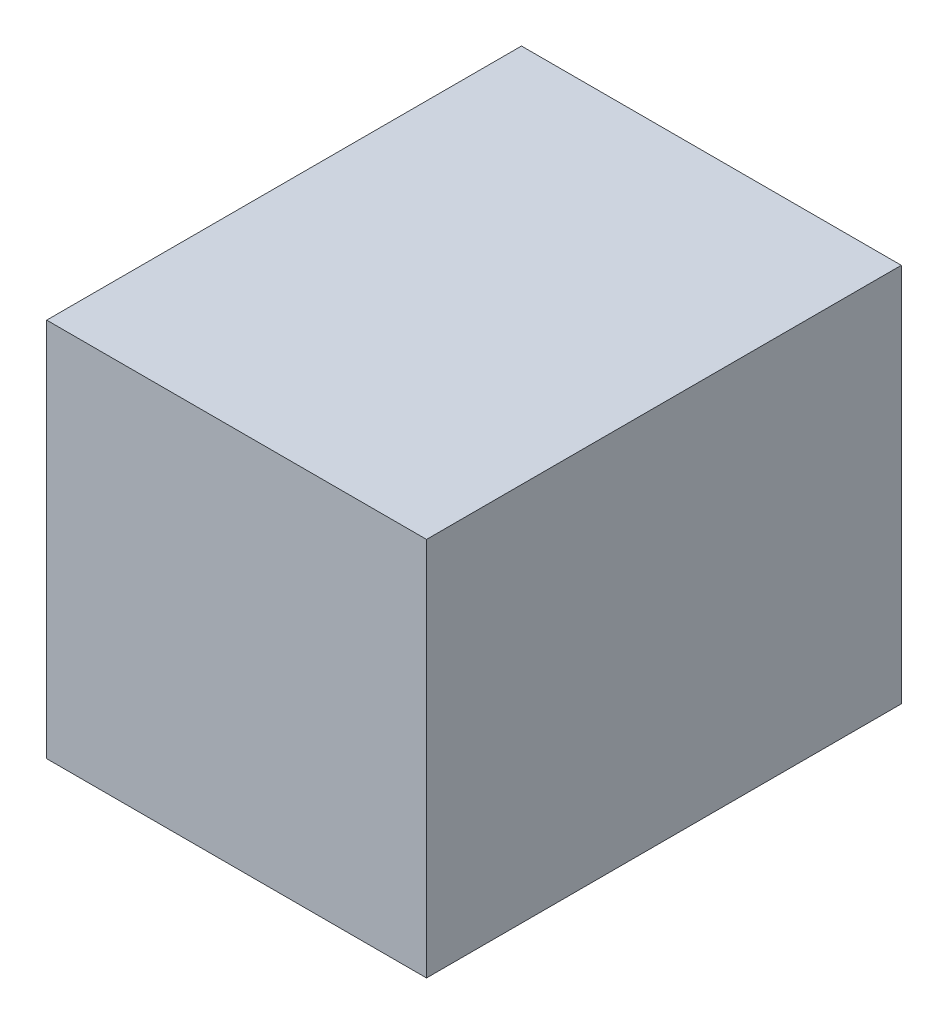
ISO-10303-21;
HEADER;
FILE_DESCRIPTION(('STEP AP214'),'2;1');
FILE_NAME('part.step','',(''),(''),'','','');
FILE_SCHEMA(('AUTOMOTIVE_DESIGN { 1 0 10303 214 1 1 1 1 }'));
ENDSEC;
DATA;
#1=APPLICATION_CONTEXT('core data for automotive mechanical design processes');
#2=APPLICATION_PROTOCOL_DEFINITION('international standard','automotive_design',2000,#1);
#3=PRODUCT_CONTEXT('',#1,'mechanical');
#4=PRODUCT('Part','Part','',(#3));
#5=PRODUCT_RELATED_PRODUCT_CATEGORY('part','',(#4));
#6=PRODUCT_DEFINITION_FORMATION('','',#4);
#7=PRODUCT_DEFINITION_CONTEXT('part definition',#1,'design');
#8=PRODUCT_DEFINITION('design','',#6,#7);
#9=PRODUCT_DEFINITION_SHAPE('','',#8);
#10=(LENGTH_UNIT() NAMED_UNIT(*) SI_UNIT(.MILLI.,.METRE.));
#11=(NAMED_UNIT(*) PLANE_ANGLE_UNIT() SI_UNIT($,.RADIAN.));
#12=(NAMED_UNIT(*) SI_UNIT($,.STERADIAN.) SOLID_ANGLE_UNIT());
#13=UNCERTAINTY_MEASURE_WITH_UNIT(LENGTH_MEASURE(1.E-05),#10,'distance_accuracy_value','');
#14=(GEOMETRIC_REPRESENTATION_CONTEXT(3) GLOBAL_UNCERTAINTY_ASSIGNED_CONTEXT((#13)) GLOBAL_UNIT_ASSIGNED_CONTEXT((#10,
#11,#12)) REPRESENTATION_CONTEXT('',''));
#15=CARTESIAN_POINT('',(0.,0.,0.));
#16=DIRECTION('',(0.,0.,1.));
#17=DIRECTION('',(1.,0.,0.));
#18=AXIS2_PLACEMENT_3D('',#15,#16,#17);
#19=CARTESIAN_POINT('',(80.,160.,-100.));
#20=DIRECTION('',(-1.,0.,0.));
#21=DIRECTION('',(0.,0.,1.));
#22=AXIS2_PLACEMENT_3D('',#19,#20,#21);
#23=PLANE('',#22);
#24=DIRECTION('',(0.,0.,-1.));
#25=VECTOR('',#24,1.);
#26=CARTESIAN_POINT('',(80.,0.,-100.));
#27=LINE('',#26,#25);
#28=CARTESIAN_POINT('',(80.,0.,100.));
#29=VERTEX_POINT('',#28);
#30=CARTESIAN_POINT('',(80.,0.,-100.));
#31=VERTEX_POINT('',#30);
#32=EDGE_CURVE('E97',#29,#31,#27,.T.);
#33=ORIENTED_EDGE('',*,*,#32,.T.);
#34=DIRECTION('',(0.,-1.,0.));
#35=VECTOR('',#34,1.);
#36=CARTESIAN_POINT('',(80.,160.,-100.));
#37=LINE('',#36,#35);
#38=CARTESIAN_POINT('',(80.,160.,-100.));
#39=VERTEX_POINT('',#38);
#40=EDGE_CURVE('E11',#39,#31,#37,.T.);
#41=ORIENTED_EDGE('',*,*,#40,.F.);
#42=DIRECTION('',(0.,0.,-1.));
#43=VECTOR('',#42,1.);
#44=CARTESIAN_POINT('',(80.,160.,-100.));
#45=LINE('',#44,#43);
#46=CARTESIAN_POINT('',(80.,160.,100.));
#47=VERTEX_POINT('',#46);
#48=EDGE_CURVE('E85',#47,#39,#45,.T.);
#49=ORIENTED_EDGE('',*,*,#48,.F.);
#50=DIRECTION('',(0.,-1.,0.));
#51=VECTOR('',#50,1.);
#52=CARTESIAN_POINT('',(80.,160.,100.));
#53=LINE('',#52,#51);
#54=EDGE_CURVE('E93',#47,#29,#53,.T.);
#55=ORIENTED_EDGE('',*,*,#54,.T.);
#56=EDGE_LOOP('',(#33,#41,#49,#55));
#57=FACE_BOUND('',#56,.T.);
#58=ADVANCED_FACE('F34',(#57),#23,.F.);
#59=CARTESIAN_POINT('',(-80.,160.,-100.));
#60=DIRECTION('',(0.,0.,1.));
#61=DIRECTION('',(1.,0.,0.));
#62=AXIS2_PLACEMENT_3D('',#59,#60,#61);
#63=PLANE('',#62);
#64=DIRECTION('',(-1.,0.,0.));
#65=VECTOR('',#64,1.);
#66=CARTESIAN_POINT('',(-80.,0.,-100.));
#67=LINE('',#66,#65);
#68=CARTESIAN_POINT('',(-80.,0.,-100.));
#69=VERTEX_POINT('',#68);
#70=EDGE_CURVE('E89',#31,#69,#67,.T.);
#71=ORIENTED_EDGE('',*,*,#70,.T.);
#72=DIRECTION('',(0.,-1.,0.));
#73=VECTOR('',#72,1.);
#74=CARTESIAN_POINT('',(-80.,160.,-100.));
#75=LINE('',#74,#73);
#76=CARTESIAN_POINT('',(-80.,160.,-100.));
#77=VERTEX_POINT('',#76);
#78=EDGE_CURVE('E42',#77,#69,#75,.T.);
#79=ORIENTED_EDGE('',*,*,#78,.F.);
#80=DIRECTION('',(-1.,0.,0.));
#81=VECTOR('',#80,1.);
#82=CARTESIAN_POINT('',(-80.,160.,-100.));
#83=LINE('',#82,#81);
#84=EDGE_CURVE('E80',#39,#77,#83,.T.);
#85=ORIENTED_EDGE('',*,*,#84,.F.);
#86=ORIENTED_EDGE('',*,*,#40,.T.);
#87=EDGE_LOOP('',(#71,#79,#85,#86));
#88=FACE_BOUND('',#87,.T.);
#89=ADVANCED_FACE('F88',(#88),#63,.F.);
#90=CARTESIAN_POINT('',(-80.,160.,-100.));
#91=DIRECTION('',(1.,0.,0.));
#92=DIRECTION('',(0.,0.,-1.));
#93=AXIS2_PLACEMENT_3D('',#90,#91,#92);
#94=PLANE('',#93);
#95=DIRECTION('',(0.,0.,1.));
#96=VECTOR('',#95,1.);
#97=CARTESIAN_POINT('',(-80.,0.,-100.));
#98=LINE('',#97,#96);
#99=CARTESIAN_POINT('',(-80.,0.,100.));
#100=VERTEX_POINT('',#99);
#101=EDGE_CURVE('E67',#69,#100,#98,.T.);
#102=ORIENTED_EDGE('',*,*,#101,.T.);
#103=DIRECTION('',(0.,-1.,0.));
#104=VECTOR('',#103,1.);
#105=CARTESIAN_POINT('',(-80.,160.,100.));
#106=LINE('',#105,#104);
#107=CARTESIAN_POINT('',(-80.,160.,100.));
#108=VERTEX_POINT('',#107);
#109=EDGE_CURVE('E90',#108,#100,#106,.T.);
#110=ORIENTED_EDGE('',*,*,#109,.F.);
#111=DIRECTION('',(0.,0.,1.));
#112=VECTOR('',#111,1.);
#113=CARTESIAN_POINT('',(-80.,160.,-100.));
#114=LINE('',#113,#112);
#115=EDGE_CURVE('E83',#77,#108,#114,.T.);
#116=ORIENTED_EDGE('',*,*,#115,.F.);
#117=ORIENTED_EDGE('',*,*,#78,.T.);
#118=EDGE_LOOP('',(#102,#110,#116,#117));
#119=FACE_BOUND('',#118,.T.);
#120=ADVANCED_FACE('F91',(#119),#94,.F.);
#121=CARTESIAN_POINT('',(-80.,160.,100.));
#122=DIRECTION('',(0.,0.,-1.));
#123=DIRECTION('',(-1.,0.,0.));
#124=AXIS2_PLACEMENT_3D('',#121,#122,#123);
#125=PLANE('',#124);
#126=DIRECTION('',(1.,0.,0.));
#127=VECTOR('',#126,1.);
#128=CARTESIAN_POINT('',(-80.,0.,100.));
#129=LINE('',#128,#127);
#130=EDGE_CURVE('E73',#100,#29,#129,.T.);
#131=ORIENTED_EDGE('',*,*,#130,.T.);
#132=ORIENTED_EDGE('',*,*,#54,.F.);
#133=DIRECTION('',(1.,0.,0.));
#134=VECTOR('',#133,1.);
#135=CARTESIAN_POINT('',(-80.,160.,100.));
#136=LINE('',#135,#134);
#137=EDGE_CURVE('E50',#108,#47,#136,.T.);
#138=ORIENTED_EDGE('',*,*,#137,.F.);
#139=ORIENTED_EDGE('',*,*,#109,.T.);
#140=EDGE_LOOP('',(#131,#132,#138,#139));
#141=FACE_BOUND('',#140,.T.);
#142=ADVANCED_FACE('F104',(#141),#125,.F.);
#143=CARTESIAN_POINT('',(0.,160.,0.));
#144=DIRECTION('',(0.,1.,0.));
#145=DIRECTION('',(0.,0.,1.));
#146=AXIS2_PLACEMENT_3D('',#143,#144,#145);
#147=PLANE('',#146);
#148=ORIENTED_EDGE('',*,*,#48,.T.);
#149=ORIENTED_EDGE('',*,*,#84,.T.);
#150=ORIENTED_EDGE('',*,*,#115,.T.);
#151=ORIENTED_EDGE('',*,*,#137,.T.);
#152=EDGE_LOOP('',(#148,#149,#150,#151));
#153=FACE_BOUND('',#152,.T.);
#154=ADVANCED_FACE('F81',(#153),#147,.T.);
#155=CARTESIAN_POINT('',(0.,0.,0.));
#156=DIRECTION('',(0.,1.,0.));
#157=DIRECTION('',(0.,0.,1.));
#158=AXIS2_PLACEMENT_3D('',#155,#156,#157);
#159=PLANE('',#158);
#160=ORIENTED_EDGE('',*,*,#32,.F.);
#161=ORIENTED_EDGE('',*,*,#130,.F.);
#162=ORIENTED_EDGE('',*,*,#101,.F.);
#163=ORIENTED_EDGE('',*,*,#70,.F.);
#164=EDGE_LOOP('',(#160,#161,#162,#163));
#165=FACE_BOUND('',#164,.T.);
#166=ADVANCED_FACE('F107',(#165),#159,.F.);
#167=CLOSED_SHELL('',(#58,#89,#120,#142,#154,#166));
#168=MANIFOLD_SOLID_BREP('B2',#167);
#169=ADVANCED_BREP_SHAPE_REPRESENTATION('',(#18,#168),#14);
#170=SHAPE_DEFINITION_REPRESENTATION(#9,#169);
ENDSEC;
END-ISO-10303-21;
